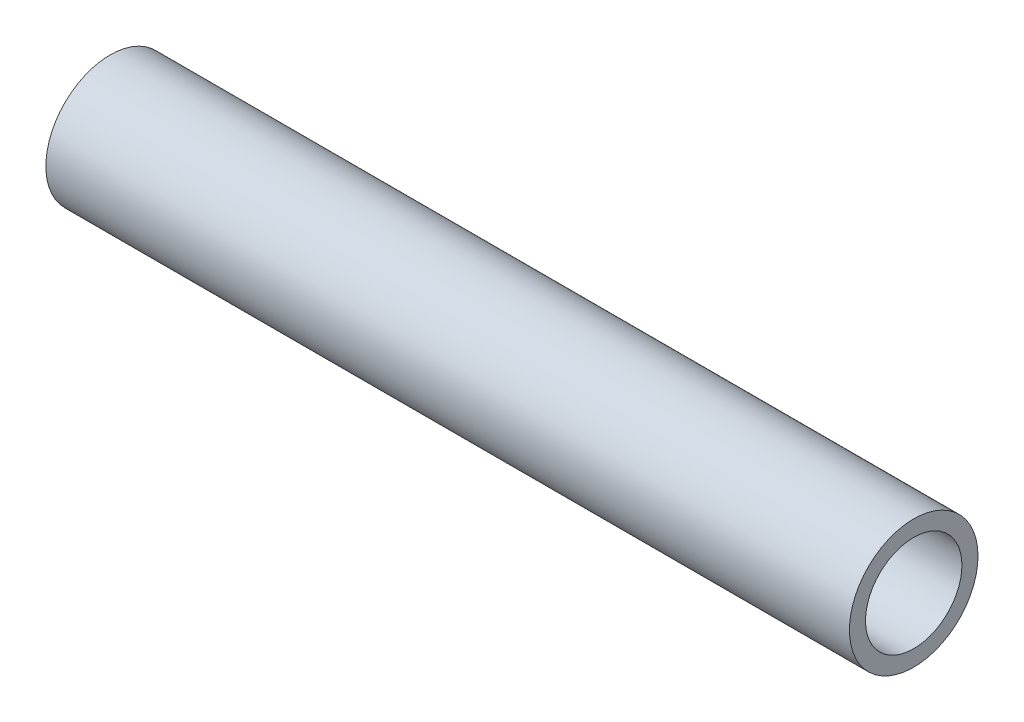
ISO-10303-21;
HEADER;
FILE_DESCRIPTION(('STEP AP214'),'2;1');
FILE_NAME('part.step','',(''),(''),'','','');
FILE_SCHEMA(('AUTOMOTIVE_DESIGN { 1 0 10303 214 1 1 1 1 }'));
ENDSEC;
DATA;
#1=APPLICATION_CONTEXT('core data for automotive mechanical design processes');
#2=APPLICATION_PROTOCOL_DEFINITION('international standard','automotive_design',2000,#1);
#3=PRODUCT_CONTEXT('',#1,'mechanical');
#4=PRODUCT('Part','Part','',(#3));
#5=PRODUCT_RELATED_PRODUCT_CATEGORY('part','',(#4));
#6=PRODUCT_DEFINITION_FORMATION('','',#4);
#7=PRODUCT_DEFINITION_CONTEXT('part definition',#1,'design');
#8=PRODUCT_DEFINITION('design','',#6,#7);
#9=PRODUCT_DEFINITION_SHAPE('','',#8);
#10=(LENGTH_UNIT() NAMED_UNIT(*) SI_UNIT(.MILLI.,.METRE.));
#11=(NAMED_UNIT(*) PLANE_ANGLE_UNIT() SI_UNIT($,.RADIAN.));
#12=(NAMED_UNIT(*) SI_UNIT($,.STERADIAN.) SOLID_ANGLE_UNIT());
#13=UNCERTAINTY_MEASURE_WITH_UNIT(LENGTH_MEASURE(1.E-05),#10,'distance_accuracy_value','');
#14=(GEOMETRIC_REPRESENTATION_CONTEXT(3) GLOBAL_UNCERTAINTY_ASSIGNED_CONTEXT((#13)) GLOBAL_UNIT_ASSIGNED_CONTEXT((#10,
#11,#12)) REPRESENTATION_CONTEXT('',''));
#15=CARTESIAN_POINT('',(0.,0.,0.));
#16=DIRECTION('',(0.,0.,1.));
#17=DIRECTION('',(1.,0.,0.));
#18=AXIS2_PLACEMENT_3D('',#15,#16,#17);
#19=CARTESIAN_POINT('',(50.,0.,0.));
#20=DIRECTION('',(-1.,0.,0.));
#21=DIRECTION('',(0.,0.,1.));
#22=AXIS2_PLACEMENT_3D('',#19,#20,#21);
#23=CYLINDRICAL_SURFACE('',#22,4.);
#24=CARTESIAN_POINT('',(50.,0.,0.));
#25=DIRECTION('',(1.,0.,0.));
#26=DIRECTION('',(0.,0.,-1.));
#27=AXIS2_PLACEMENT_3D('',#24,#25,#26);
#28=CIRCLE('',#27,4.);
#29=CARTESIAN_POINT('',(50.,0.,-4.));
#30=VERTEX_POINT('',#29);
#31=EDGE_CURVE('E10',#30,#30,#28,.T.);
#32=ORIENTED_EDGE('',*,*,#31,.F.);
#33=EDGE_LOOP('',(#32));
#34=FACE_BOUND('',#33,.T.);
#35=CARTESIAN_POINT('',(0.,0.,0.));
#36=DIRECTION('',(1.,0.,0.));
#37=DIRECTION('',(0.,0.,-1.));
#38=AXIS2_PLACEMENT_3D('',#35,#36,#37);
#39=CIRCLE('',#38,4.);
#40=CARTESIAN_POINT('',(0.,0.,-4.));
#41=VERTEX_POINT('',#40);
#42=EDGE_CURVE('E40',#41,#41,#39,.T.);
#43=ORIENTED_EDGE('',*,*,#42,.T.);
#44=EDGE_LOOP('',(#43));
#45=FACE_BOUND('',#44,.T.);
#46=ADVANCED_FACE('F37',(#34,#45),#23,.T.);
#47=CARTESIAN_POINT('',(50.,0.,0.));
#48=DIRECTION('',(1.,0.,0.));
#49=DIRECTION('',(0.,0.,-1.));
#50=AXIS2_PLACEMENT_3D('',#47,#48,#49);
#51=PLANE('',#50);
#52=CARTESIAN_POINT('',(50.,0.,0.));
#53=DIRECTION('',(1.,0.,0.));
#54=DIRECTION('',(0.,0.,-1.));
#55=AXIS2_PLACEMENT_3D('',#52,#53,#54);
#56=CIRCLE('',#55,3.);
#57=CARTESIAN_POINT('',(50.,0.,-3.));
#58=VERTEX_POINT('',#57);
#59=EDGE_CURVE('E49',#58,#58,#56,.T.);
#60=ORIENTED_EDGE('',*,*,#59,.F.);
#61=EDGE_LOOP('',(#60));
#62=FACE_BOUND('',#61,.T.);
#63=ORIENTED_EDGE('',*,*,#31,.T.);
#64=EDGE_LOOP('',(#63));
#65=FACE_BOUND('',#64,.T.);
#66=ADVANCED_FACE('F69',(#62,#65),#51,.T.);
#67=CARTESIAN_POINT('',(0.,0.,0.));
#68=DIRECTION('',(1.,0.,0.));
#69=DIRECTION('',(0.,0.,-1.));
#70=AXIS2_PLACEMENT_3D('',#67,#68,#69);
#71=PLANE('',#70);
#72=CARTESIAN_POINT('',(0.,0.,0.));
#73=DIRECTION('',(1.,0.,0.));
#74=DIRECTION('',(0.,0.,-1.));
#75=AXIS2_PLACEMENT_3D('',#72,#73,#74);
#76=CIRCLE('',#75,3.);
#77=CARTESIAN_POINT('',(0.,0.,-3.));
#78=VERTEX_POINT('',#77);
#79=EDGE_CURVE('E54',#78,#78,#76,.T.);
#80=ORIENTED_EDGE('',*,*,#79,.T.);
#81=EDGE_LOOP('',(#80));
#82=FACE_BOUND('',#81,.T.);
#83=ORIENTED_EDGE('',*,*,#42,.F.);
#84=EDGE_LOOP('',(#83));
#85=FACE_BOUND('',#84,.T.);
#86=ADVANCED_FACE('F59',(#82,#85),#71,.F.);
#87=CARTESIAN_POINT('',(0.,0.,0.));
#88=DIRECTION('',(1.,0.,0.));
#89=DIRECTION('',(0.,0.,-1.));
#90=AXIS2_PLACEMENT_3D('',#87,#88,#89);
#91=CYLINDRICAL_SURFACE('',#90,3.);
#92=ORIENTED_EDGE('',*,*,#59,.T.);
#93=EDGE_LOOP('',(#92));
#94=FACE_BOUND('',#93,.T.);
#95=ORIENTED_EDGE('',*,*,#79,.F.);
#96=EDGE_LOOP('',(#95));
#97=FACE_BOUND('',#96,.T.);
#98=ADVANCED_FACE('F62',(#94,#97),#91,.F.);
#99=CLOSED_SHELL('',(#46,#66,#86,#98));
#100=MANIFOLD_SOLID_BREP('B2',#99);
#101=ADVANCED_BREP_SHAPE_REPRESENTATION('',(#18,#100),#14);
#102=SHAPE_DEFINITION_REPRESENTATION(#9,#101);
ENDSEC;
END-ISO-10303-21;
